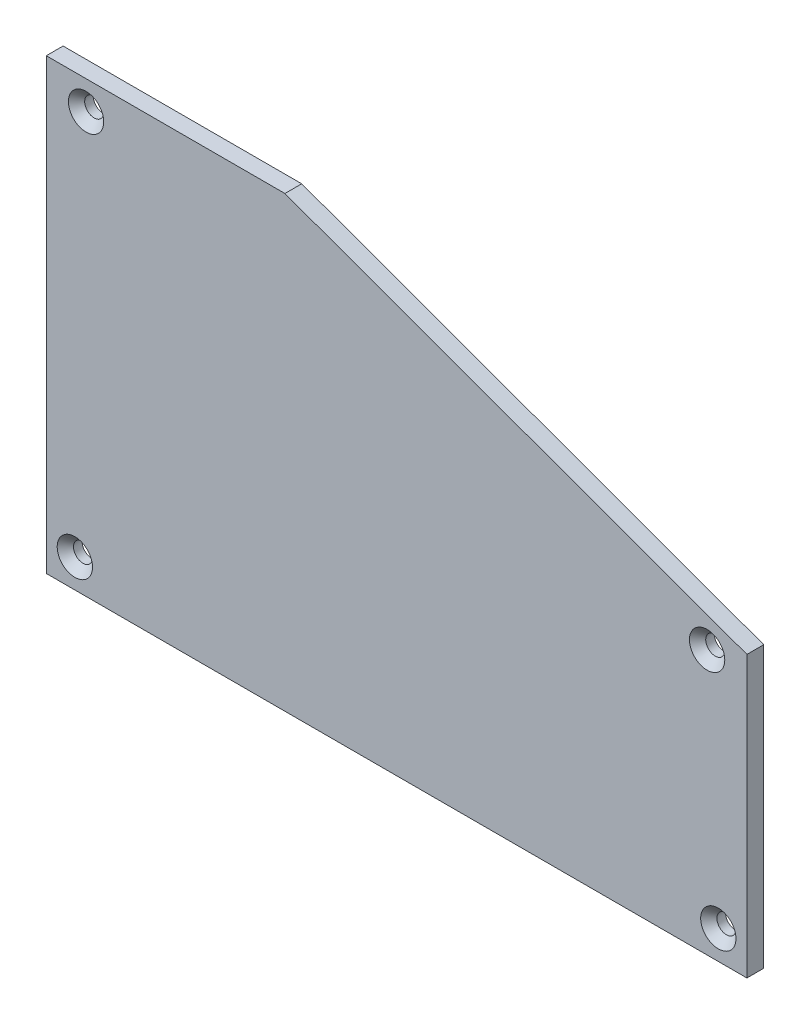
ISO-10303-21;
HEADER;
FILE_DESCRIPTION(('STEP AP214'),'2;1');
FILE_NAME('part.step','',(''),(''),'','','');
FILE_SCHEMA(('AUTOMOTIVE_DESIGN { 1 0 10303 214 1 1 1 1 }'));
ENDSEC;
DATA;
#1=APPLICATION_CONTEXT('core data for automotive mechanical design processes');
#2=APPLICATION_PROTOCOL_DEFINITION('international standard','automotive_design',2000,#1);
#3=PRODUCT_CONTEXT('',#1,'mechanical');
#4=PRODUCT('Part','Part','',(#3));
#5=PRODUCT_RELATED_PRODUCT_CATEGORY('part','',(#4));
#6=PRODUCT_DEFINITION_FORMATION('','',#4);
#7=PRODUCT_DEFINITION_CONTEXT('part definition',#1,'design');
#8=PRODUCT_DEFINITION('design','',#6,#7);
#9=PRODUCT_DEFINITION_SHAPE('','',#8);
#10=(LENGTH_UNIT() NAMED_UNIT(*) SI_UNIT(.MILLI.,.METRE.));
#11=(NAMED_UNIT(*) PLANE_ANGLE_UNIT() SI_UNIT($,.RADIAN.));
#12=(NAMED_UNIT(*) SI_UNIT($,.STERADIAN.) SOLID_ANGLE_UNIT());
#13=UNCERTAINTY_MEASURE_WITH_UNIT(LENGTH_MEASURE(1.E-05),#10,'distance_accuracy_value','');
#14=(GEOMETRIC_REPRESENTATION_CONTEXT(3) GLOBAL_UNCERTAINTY_ASSIGNED_CONTEXT((#13)) GLOBAL_UNIT_ASSIGNED_CONTEXT((#10,
#11,#12)) REPRESENTATION_CONTEXT('',''));
#15=CARTESIAN_POINT('',(0.,0.,0.));
#16=DIRECTION('',(0.,0.,1.));
#17=DIRECTION('',(1.,0.,0.));
#18=AXIS2_PLACEMENT_3D('',#15,#16,#17);
#19=CARTESIAN_POINT('',(-62.5,80.,3.));
#20=DIRECTION('',(0.,-1.,0.));
#21=DIRECTION('',(0.,0.,-1.));
#22=AXIS2_PLACEMENT_3D('',#19,#20,#21);
#23=PLANE('',#22);
#24=DIRECTION('',(-1.,0.,0.));
#25=VECTOR('',#24,1.);
#26=CARTESIAN_POINT('',(-62.5,80.,0.));
#27=LINE('',#26,#25);
#28=CARTESIAN_POINT('',(-19.9243225836386,80.,0.));
#29=VERTEX_POINT('',#28);
#30=CARTESIAN_POINT('',(-62.5,80.,0.));
#31=VERTEX_POINT('',#30);
#32=EDGE_CURVE('E107',#29,#31,#27,.T.);
#33=ORIENTED_EDGE('',*,*,#32,.T.);
#34=DIRECTION('',(0.,0.,-1.));
#35=VECTOR('',#34,1.);
#36=CARTESIAN_POINT('',(-62.5,80.,3.));
#37=LINE('',#36,#35);
#38=CARTESIAN_POINT('',(-62.5,80.,3.));
#39=VERTEX_POINT('',#38);
#40=EDGE_CURVE('E11',#39,#31,#37,.T.);
#41=ORIENTED_EDGE('',*,*,#40,.F.);
#42=DIRECTION('',(-1.,0.,0.));
#43=VECTOR('',#42,1.);
#44=CARTESIAN_POINT('',(-62.5,80.,3.));
#45=LINE('',#44,#43);
#46=CARTESIAN_POINT('',(-19.9243225836386,80.,3.));
#47=VERTEX_POINT('',#46);
#48=EDGE_CURVE('E116',#47,#39,#45,.T.);
#49=ORIENTED_EDGE('',*,*,#48,.F.);
#50=DIRECTION('',(0.,0.,-1.));
#51=VECTOR('',#50,1.);
#52=CARTESIAN_POINT('',(-19.9243225836386,80.,3.));
#53=LINE('',#52,#51);
#54=EDGE_CURVE('E103',#47,#29,#53,.T.);
#55=ORIENTED_EDGE('',*,*,#54,.T.);
#56=EDGE_LOOP('',(#33,#41,#49,#55));
#57=FACE_BOUND('',#56,.T.);
#58=ADVANCED_FACE('F33',(#57),#23,.F.);
#59=CARTESIAN_POINT('',(-62.5,0.,3.));
#60=DIRECTION('',(1.,0.,0.));
#61=DIRECTION('',(0.,1.,0.));
#62=AXIS2_PLACEMENT_3D('',#59,#60,#61);
#63=PLANE('',#62);
#64=DIRECTION('',(0.,-1.,0.));
#65=VECTOR('',#64,1.);
#66=CARTESIAN_POINT('',(-62.5,0.,0.));
#67=LINE('',#66,#65);
#68=CARTESIAN_POINT('',(-62.5,0.,0.));
#69=VERTEX_POINT('',#68);
#70=EDGE_CURVE('E110',#31,#69,#67,.T.);
#71=ORIENTED_EDGE('',*,*,#70,.T.);
#72=DIRECTION('',(0.,0.,-1.));
#73=VECTOR('',#72,1.);
#74=CARTESIAN_POINT('',(-62.5,0.,3.));
#75=LINE('',#74,#73);
#76=CARTESIAN_POINT('',(-62.5,0.,3.));
#77=VERTEX_POINT('',#76);
#78=EDGE_CURVE('E41',#77,#69,#75,.T.);
#79=ORIENTED_EDGE('',*,*,#78,.F.);
#80=DIRECTION('',(0.,-1.,0.));
#81=VECTOR('',#80,1.);
#82=CARTESIAN_POINT('',(-62.5,0.,3.));
#83=LINE('',#82,#81);
#84=EDGE_CURVE('E83',#39,#77,#83,.T.);
#85=ORIENTED_EDGE('',*,*,#84,.F.);
#86=ORIENTED_EDGE('',*,*,#40,.T.);
#87=EDGE_LOOP('',(#71,#79,#85,#86));
#88=FACE_BOUND('',#87,.T.);
#89=ADVANCED_FACE('F136',(#88),#63,.F.);
#90=CARTESIAN_POINT('',(62.5,0.,3.));
#91=DIRECTION('',(0.,1.,0.));
#92=DIRECTION('',(-1.,0.,0.));
#93=AXIS2_PLACEMENT_3D('',#90,#91,#92);
#94=PLANE('',#93);
#95=DIRECTION('',(1.,0.,0.));
#96=VECTOR('',#95,1.);
#97=CARTESIAN_POINT('',(62.5,0.,0.));
#98=LINE('',#97,#96);
#99=CARTESIAN_POINT('',(62.5,0.,0.));
#100=VERTEX_POINT('',#99);
#101=EDGE_CURVE('E98',#69,#100,#98,.T.);
#102=ORIENTED_EDGE('',*,*,#101,.T.);
#103=DIRECTION('',(0.,0.,-1.));
#104=VECTOR('',#103,1.);
#105=CARTESIAN_POINT('',(62.5,0.,3.));
#106=LINE('',#105,#104);
#107=CARTESIAN_POINT('',(62.5,0.,3.));
#108=VERTEX_POINT('',#107);
#109=EDGE_CURVE('E95',#108,#100,#106,.T.);
#110=ORIENTED_EDGE('',*,*,#109,.F.);
#111=DIRECTION('',(1.,0.,0.));
#112=VECTOR('',#111,1.);
#113=CARTESIAN_POINT('',(62.5,0.,3.));
#114=LINE('',#113,#112);
#115=EDGE_CURVE('E87',#77,#108,#114,.T.);
#116=ORIENTED_EDGE('',*,*,#115,.F.);
#117=ORIENTED_EDGE('',*,*,#78,.T.);
#118=EDGE_LOOP('',(#102,#110,#116,#117));
#119=FACE_BOUND('',#118,.T.);
#120=ADVANCED_FACE('F96',(#119),#94,.F.);
#121=CARTESIAN_POINT('',(62.5,50.,3.));
#122=DIRECTION('',(-1.,0.,0.));
#123=DIRECTION('',(0.,0.,1.));
#124=AXIS2_PLACEMENT_3D('',#121,#122,#123);
#125=PLANE('',#124);
#126=DIRECTION('',(0.,1.,0.));
#127=VECTOR('',#126,1.);
#128=CARTESIAN_POINT('',(62.5,50.,0.));
#129=LINE('',#128,#127);
#130=CARTESIAN_POINT('',(62.5,50.,0.));
#131=VERTEX_POINT('',#130);
#132=EDGE_CURVE('E69',#100,#131,#129,.T.);
#133=ORIENTED_EDGE('',*,*,#132,.T.);
#134=DIRECTION('',(0.,0.,-1.));
#135=VECTOR('',#134,1.);
#136=CARTESIAN_POINT('',(62.5,50.,3.));
#137=LINE('',#136,#135);
#138=CARTESIAN_POINT('',(62.5,50.,3.));
#139=VERTEX_POINT('',#138);
#140=EDGE_CURVE('E99',#139,#131,#137,.T.);
#141=ORIENTED_EDGE('',*,*,#140,.F.);
#142=DIRECTION('',(0.,1.,0.));
#143=VECTOR('',#142,1.);
#144=CARTESIAN_POINT('',(62.5,50.,3.));
#145=LINE('',#144,#143);
#146=EDGE_CURVE('E91',#108,#139,#145,.T.);
#147=ORIENTED_EDGE('',*,*,#146,.F.);
#148=ORIENTED_EDGE('',*,*,#109,.T.);
#149=EDGE_LOOP('',(#133,#141,#147,#148));
#150=FACE_BOUND('',#149,.T.);
#151=ADVANCED_FACE('F101',(#150),#125,.F.);
#152=CARTESIAN_POINT('',(-19.9243225836386,80.,3.));
#153=DIRECTION('',(-0.34202014332567,-0.939692620785908,0.));
#154=DIRECTION('',(0.939692620785908,-0.34202014332567,0.));
#155=AXIS2_PLACEMENT_3D('',#152,#153,#154);
#156=PLANE('',#155);
#157=DIRECTION('',(-0.939692620785908,0.34202014332567,0.));
#158=VECTOR('',#157,1.);
#159=CARTESIAN_POINT('',(-19.9243225836386,80.,0.));
#160=LINE('',#159,#158);
#161=EDGE_CURVE('E75',#131,#29,#160,.T.);
#162=ORIENTED_EDGE('',*,*,#161,.T.);
#163=ORIENTED_EDGE('',*,*,#54,.F.);
#164=DIRECTION('',(-0.939692620785908,0.34202014332567,0.));
#165=VECTOR('',#164,1.);
#166=CARTESIAN_POINT('',(-19.9243225836386,80.,3.));
#167=LINE('',#166,#165);
#168=EDGE_CURVE('E49',#139,#47,#167,.T.);
#169=ORIENTED_EDGE('',*,*,#168,.F.);
#170=ORIENTED_EDGE('',*,*,#140,.T.);
#171=EDGE_LOOP('',(#162,#163,#169,#170));
#172=FACE_BOUND('',#171,.T.);
#173=ADVANCED_FACE('F124',(#172),#156,.F.);
#174=CARTESIAN_POINT('',(0.,0.,3.));
#175=DIRECTION('',(0.,0.,-1.));
#176=DIRECTION('',(-1.,0.,0.));
#177=AXIS2_PLACEMENT_3D('',#174,#175,#176);
#178=PLANE('',#177);
#179=CARTESIAN_POINT('',(-55.4,74.9,3.));
#180=DIRECTION('',(0.,0.,1.));
#181=DIRECTION('',(1.,0.,0.));
#182=AXIS2_PLACEMENT_3D('',#179,#180,#181);
#183=CIRCLE('',#182,3.15);
#184=CARTESIAN_POINT('',(-52.25,74.9,3.));
#185=VERTEX_POINT('',#184);
#186=EDGE_CURVE('E258',#185,#185,#183,.T.);
#187=ORIENTED_EDGE('',*,*,#186,.F.);
#188=EDGE_LOOP('',(#187));
#189=FACE_BOUND('',#188,.T.);
#190=CARTESIAN_POINT('',(-57.4,5.1,3.));
#191=DIRECTION('',(0.,0.,1.));
#192=DIRECTION('',(1.,0.,0.));
#193=AXIS2_PLACEMENT_3D('',#190,#191,#192);
#194=CIRCLE('',#193,3.15);
#195=CARTESIAN_POINT('',(-54.25,5.1,3.));
#196=VERTEX_POINT('',#195);
#197=EDGE_CURVE('E265',#196,#196,#194,.T.);
#198=ORIENTED_EDGE('',*,*,#197,.F.);
#199=EDGE_LOOP('',(#198));
#200=FACE_BOUND('',#199,.T.);
#201=CARTESIAN_POINT('',(55.4,47.1568820236629,3.));
#202=DIRECTION('',(0.,0.,1.));
#203=DIRECTION('',(1.,0.,0.));
#204=AXIS2_PLACEMENT_3D('',#201,#202,#203);
#205=CIRCLE('',#204,3.15);
#206=CARTESIAN_POINT('',(58.55,47.1568820236629,3.));
#207=VERTEX_POINT('',#206);
#208=EDGE_CURVE('E274',#207,#207,#205,.T.);
#209=ORIENTED_EDGE('',*,*,#208,.F.);
#210=EDGE_LOOP('',(#209));
#211=FACE_BOUND('',#210,.T.);
#212=CARTESIAN_POINT('',(57.4,5.1,3.));
#213=DIRECTION('',(0.,0.,1.));
#214=DIRECTION('',(1.,0.,0.));
#215=AXIS2_PLACEMENT_3D('',#212,#213,#214);
#216=CIRCLE('',#215,3.15);
#217=CARTESIAN_POINT('',(60.55,5.1,3.));
#218=VERTEX_POINT('',#217);
#219=EDGE_CURVE('E283',#218,#218,#216,.T.);
#220=ORIENTED_EDGE('',*,*,#219,.F.);
#221=EDGE_LOOP('',(#220));
#222=FACE_BOUND('',#221,.T.);
#223=ORIENTED_EDGE('',*,*,#48,.T.);
#224=ORIENTED_EDGE('',*,*,#84,.T.);
#225=ORIENTED_EDGE('',*,*,#115,.T.);
#226=ORIENTED_EDGE('',*,*,#146,.T.);
#227=ORIENTED_EDGE('',*,*,#168,.T.);
#228=EDGE_LOOP('',(#223,#224,#225,#226,#227));
#229=FACE_BOUND('',#228,.T.);
#230=ADVANCED_FACE('F89',(#189,#200,#211,#222,#229),#178,.F.);
#231=CARTESIAN_POINT('',(0.,0.,0.));
#232=DIRECTION('',(0.,0.,-1.));
#233=DIRECTION('',(-1.,0.,0.));
#234=AXIS2_PLACEMENT_3D('',#231,#232,#233);
#235=PLANE('',#234);
#236=CARTESIAN_POINT('',(-55.4,74.9,0.));
#237=DIRECTION('',(0.,0.,1.));
#238=DIRECTION('',(1.,0.,0.));
#239=AXIS2_PLACEMENT_3D('',#236,#237,#238);
#240=CIRCLE('',#239,1.69999999999999);
#241=CARTESIAN_POINT('',(-53.7,74.9,0.));
#242=VERTEX_POINT('',#241);
#243=EDGE_CURVE('E260',#242,#242,#240,.T.);
#244=ORIENTED_EDGE('',*,*,#243,.T.);
#245=EDGE_LOOP('',(#244));
#246=FACE_BOUND('',#245,.T.);
#247=CARTESIAN_POINT('',(-57.4,5.1,0.));
#248=DIRECTION('',(0.,0.,1.));
#249=DIRECTION('',(1.,0.,0.));
#250=AXIS2_PLACEMENT_3D('',#247,#248,#249);
#251=CIRCLE('',#250,1.69999999999999);
#252=CARTESIAN_POINT('',(-55.7,5.1,0.));
#253=VERTEX_POINT('',#252);
#254=EDGE_CURVE('E271',#253,#253,#251,.T.);
#255=ORIENTED_EDGE('',*,*,#254,.T.);
#256=EDGE_LOOP('',(#255));
#257=FACE_BOUND('',#256,.T.);
#258=CARTESIAN_POINT('',(55.4,47.1568820236629,0.));
#259=DIRECTION('',(0.,0.,1.));
#260=DIRECTION('',(1.,0.,0.));
#261=AXIS2_PLACEMENT_3D('',#258,#259,#260);
#262=CIRCLE('',#261,1.69999999999999);
#263=CARTESIAN_POINT('',(57.1,47.1568820236629,0.));
#264=VERTEX_POINT('',#263);
#265=EDGE_CURVE('E280',#264,#264,#262,.T.);
#266=ORIENTED_EDGE('',*,*,#265,.T.);
#267=EDGE_LOOP('',(#266));
#268=FACE_BOUND('',#267,.T.);
#269=CARTESIAN_POINT('',(57.4,5.1,0.));
#270=DIRECTION('',(0.,0.,1.));
#271=DIRECTION('',(1.,0.,0.));
#272=AXIS2_PLACEMENT_3D('',#269,#270,#271);
#273=CIRCLE('',#272,1.69999999999999);
#274=CARTESIAN_POINT('',(59.1,5.1,0.));
#275=VERTEX_POINT('',#274);
#276=EDGE_CURVE('E111',#275,#275,#273,.T.);
#277=ORIENTED_EDGE('',*,*,#276,.T.);
#278=EDGE_LOOP('',(#277));
#279=FACE_BOUND('',#278,.T.);
#280=ORIENTED_EDGE('',*,*,#32,.F.);
#281=ORIENTED_EDGE('',*,*,#161,.F.);
#282=ORIENTED_EDGE('',*,*,#132,.F.);
#283=ORIENTED_EDGE('',*,*,#101,.F.);
#284=ORIENTED_EDGE('',*,*,#70,.F.);
#285=EDGE_LOOP('',(#280,#281,#282,#283,#284));
#286=FACE_BOUND('',#285,.T.);
#287=ADVANCED_FACE('F120',(#246,#257,#268,#279,#286),#235,.T.);
#288=CARTESIAN_POINT('',(57.4,5.1,3.));
#289=DIRECTION('',(0.,0.,1.));
#290=DIRECTION('',(1.,0.,0.));
#291=AXIS2_PLACEMENT_3D('',#288,#289,#290);
#292=CYLINDRICAL_SURFACE('',#291,1.69999999999999);
#293=ORIENTED_EDGE('',*,*,#276,.F.);
#294=EDGE_LOOP('',(#293));
#295=FACE_BOUND('',#294,.T.);
#296=CARTESIAN_POINT('',(57.4,5.1,1.54999999999999));
#297=DIRECTION('',(0.,0.,1.));
#298=DIRECTION('',(1.,0.,0.));
#299=AXIS2_PLACEMENT_3D('',#296,#297,#298);
#300=CIRCLE('',#299,1.69999999999999);
#301=CARTESIAN_POINT('',(59.1,5.1,1.54999999999999));
#302=VERTEX_POINT('',#301);
#303=EDGE_CURVE('E286',#302,#302,#300,.T.);
#304=ORIENTED_EDGE('',*,*,#303,.T.);
#305=EDGE_LOOP('',(#304));
#306=FACE_BOUND('',#305,.T.);
#307=ADVANCED_FACE('F169',(#295,#306),#292,.F.);
#308=CARTESIAN_POINT('',(57.4,5.1,3.));
#309=DIRECTION('',(0.,0.,1.));
#310=DIRECTION('',(1.,0.,0.));
#311=AXIS2_PLACEMENT_3D('',#308,#309,#310);
#312=CONICAL_SURFACE('',#311,3.15,0.78539816339745);
#313=ORIENTED_EDGE('',*,*,#303,.F.);
#314=EDGE_LOOP('',(#313));
#315=FACE_BOUND('',#314,.T.);
#316=ORIENTED_EDGE('',*,*,#219,.T.);
#317=EDGE_LOOP('',(#316));
#318=FACE_BOUND('',#317,.T.);
#319=ADVANCED_FACE('F178',(#315,#318),#312,.F.);
#320=CARTESIAN_POINT('',(55.4,47.1568820236629,3.));
#321=DIRECTION('',(0.,0.,1.));
#322=DIRECTION('',(1.,0.,0.));
#323=AXIS2_PLACEMENT_3D('',#320,#321,#322);
#324=CYLINDRICAL_SURFACE('',#323,1.69999999999999);
#325=ORIENTED_EDGE('',*,*,#265,.F.);
#326=EDGE_LOOP('',(#325));
#327=FACE_BOUND('',#326,.T.);
#328=CARTESIAN_POINT('',(55.4,47.1568820236629,1.54999999999999));
#329=DIRECTION('',(0.,0.,1.));
#330=DIRECTION('',(1.,0.,0.));
#331=AXIS2_PLACEMENT_3D('',#328,#329,#330);
#332=CIRCLE('',#331,1.69999999999999);
#333=CARTESIAN_POINT('',(57.1,47.1568820236629,1.54999999999999));
#334=VERTEX_POINT('',#333);
#335=EDGE_CURVE('E277',#334,#334,#332,.T.);
#336=ORIENTED_EDGE('',*,*,#335,.T.);
#337=EDGE_LOOP('',(#336));
#338=FACE_BOUND('',#337,.T.);
#339=ADVANCED_FACE('F188',(#327,#338),#324,.F.);
#340=CARTESIAN_POINT('',(55.4,47.1568820236629,3.));
#341=DIRECTION('',(0.,0.,1.));
#342=DIRECTION('',(1.,0.,0.));
#343=AXIS2_PLACEMENT_3D('',#340,#341,#342);
#344=CONICAL_SURFACE('',#343,3.15,0.78539816339745);
#345=ORIENTED_EDGE('',*,*,#335,.F.);
#346=EDGE_LOOP('',(#345));
#347=FACE_BOUND('',#346,.T.);
#348=ORIENTED_EDGE('',*,*,#208,.T.);
#349=EDGE_LOOP('',(#348));
#350=FACE_BOUND('',#349,.T.);
#351=ADVANCED_FACE('F198',(#347,#350),#344,.F.);
#352=CARTESIAN_POINT('',(-57.4,5.1,3.));
#353=DIRECTION('',(0.,0.,1.));
#354=DIRECTION('',(1.,0.,0.));
#355=AXIS2_PLACEMENT_3D('',#352,#353,#354);
#356=CYLINDRICAL_SURFACE('',#355,1.69999999999999);
#357=ORIENTED_EDGE('',*,*,#254,.F.);
#358=EDGE_LOOP('',(#357));
#359=FACE_BOUND('',#358,.T.);
#360=CARTESIAN_POINT('',(-57.4,5.1,1.54999999999999));
#361=DIRECTION('',(0.,0.,1.));
#362=DIRECTION('',(1.,0.,0.));
#363=AXIS2_PLACEMENT_3D('',#360,#361,#362);
#364=CIRCLE('',#363,1.69999999999999);
#365=CARTESIAN_POINT('',(-55.7,5.1,1.54999999999999));
#366=VERTEX_POINT('',#365);
#367=EDGE_CURVE('E268',#366,#366,#364,.T.);
#368=ORIENTED_EDGE('',*,*,#367,.T.);
#369=EDGE_LOOP('',(#368));
#370=FACE_BOUND('',#369,.T.);
#371=ADVANCED_FACE('F208',(#359,#370),#356,.F.);
#372=CARTESIAN_POINT('',(-57.4,5.1,3.));
#373=DIRECTION('',(0.,0.,1.));
#374=DIRECTION('',(1.,0.,0.));
#375=AXIS2_PLACEMENT_3D('',#372,#373,#374);
#376=CONICAL_SURFACE('',#375,3.15,0.78539816339745);
#377=ORIENTED_EDGE('',*,*,#367,.F.);
#378=EDGE_LOOP('',(#377));
#379=FACE_BOUND('',#378,.T.);
#380=ORIENTED_EDGE('',*,*,#197,.T.);
#381=EDGE_LOOP('',(#380));
#382=FACE_BOUND('',#381,.T.);
#383=ADVANCED_FACE('F218',(#379,#382),#376,.F.);
#384=CARTESIAN_POINT('',(-55.4,74.9,3.));
#385=DIRECTION('',(0.,0.,1.));
#386=DIRECTION('',(1.,0.,0.));
#387=AXIS2_PLACEMENT_3D('',#384,#385,#386);
#388=CYLINDRICAL_SURFACE('',#387,1.69999999999999);
#389=ORIENTED_EDGE('',*,*,#243,.F.);
#390=EDGE_LOOP('',(#389));
#391=FACE_BOUND('',#390,.T.);
#392=CARTESIAN_POINT('',(-55.4,74.9,1.54999999999999));
#393=DIRECTION('',(0.,0.,1.));
#394=DIRECTION('',(1.,0.,0.));
#395=AXIS2_PLACEMENT_3D('',#392,#393,#394);
#396=CIRCLE('',#395,1.69999999999999);
#397=CARTESIAN_POINT('',(-53.7,74.9,1.54999999999999));
#398=VERTEX_POINT('',#397);
#399=EDGE_CURVE('E255',#398,#398,#396,.T.);
#400=ORIENTED_EDGE('',*,*,#399,.T.);
#401=EDGE_LOOP('',(#400));
#402=FACE_BOUND('',#401,.T.);
#403=ADVANCED_FACE('F228',(#391,#402),#388,.F.);
#404=CARTESIAN_POINT('',(-55.4,74.9,3.));
#405=DIRECTION('',(0.,0.,1.));
#406=DIRECTION('',(1.,0.,0.));
#407=AXIS2_PLACEMENT_3D('',#404,#405,#406);
#408=CONICAL_SURFACE('',#407,3.15,0.78539816339745);
#409=ORIENTED_EDGE('',*,*,#399,.F.);
#410=EDGE_LOOP('',(#409));
#411=FACE_BOUND('',#410,.T.);
#412=ORIENTED_EDGE('',*,*,#186,.T.);
#413=EDGE_LOOP('',(#412));
#414=FACE_BOUND('',#413,.T.);
#415=ADVANCED_FACE('F238',(#411,#414),#408,.F.);
#416=CLOSED_SHELL('',(#58,#89,#120,#151,#173,#230,#287,#307,#319,#339,#351,#371,#383,#403,#415));
#417=MANIFOLD_SOLID_BREP('B2',#416);
#418=ADVANCED_BREP_SHAPE_REPRESENTATION('',(#18,#417),#14);
#419=SHAPE_DEFINITION_REPRESENTATION(#9,#418);
ENDSEC;
END-ISO-10303-21;
